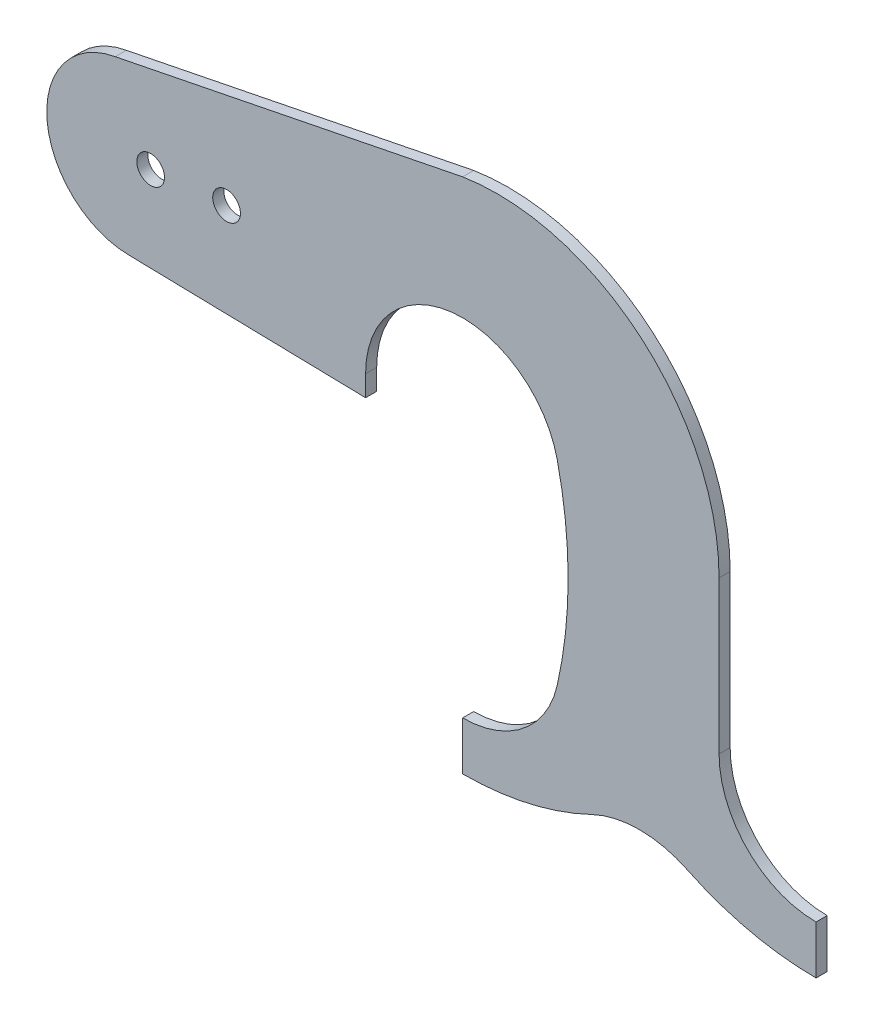
ISO-10303-21;
HEADER;
FILE_DESCRIPTION(('STEP AP214'),'2;1');
FILE_NAME('part.step','',(''),(''),'','','');
FILE_SCHEMA(('AUTOMOTIVE_DESIGN { 1 0 10303 214 1 1 1 1 }'));
ENDSEC;
DATA;
#1=APPLICATION_CONTEXT('core data for automotive mechanical design processes');
#2=APPLICATION_PROTOCOL_DEFINITION('international standard','automotive_design',2000,#1);
#3=PRODUCT_CONTEXT('',#1,'mechanical');
#4=PRODUCT('Part','Part','',(#3));
#5=PRODUCT_RELATED_PRODUCT_CATEGORY('part','',(#4));
#6=PRODUCT_DEFINITION_FORMATION('','',#4);
#7=PRODUCT_DEFINITION_CONTEXT('part definition',#1,'design');
#8=PRODUCT_DEFINITION('design','',#6,#7);
#9=PRODUCT_DEFINITION_SHAPE('','',#8);
#10=(LENGTH_UNIT() NAMED_UNIT(*) SI_UNIT(.MILLI.,.METRE.));
#11=(NAMED_UNIT(*) PLANE_ANGLE_UNIT() SI_UNIT($,.RADIAN.));
#12=(NAMED_UNIT(*) SI_UNIT($,.STERADIAN.) SOLID_ANGLE_UNIT());
#13=UNCERTAINTY_MEASURE_WITH_UNIT(LENGTH_MEASURE(1.E-05),#10,'distance_accuracy_value','');
#14=(GEOMETRIC_REPRESENTATION_CONTEXT(3) GLOBAL_UNCERTAINTY_ASSIGNED_CONTEXT((#13)) GLOBAL_UNIT_ASSIGNED_CONTEXT((#10,
#11,#12)) REPRESENTATION_CONTEXT('',''));
#15=CARTESIAN_POINT('',(0.,0.,0.));
#16=DIRECTION('',(0.,0.,1.));
#17=DIRECTION('',(1.,0.,0.));
#18=AXIS2_PLACEMENT_3D('',#15,#16,#17);
#19=CARTESIAN_POINT('',(0.,0.,10.));
#20=DIRECTION('',(0.,0.,-1.));
#21=DIRECTION('',(-1.,0.,0.));
#22=AXIS2_PLACEMENT_3D('',#19,#20,#21);
#23=PLANE('',#22);
#24=CARTESIAN_POINT('',(0.,0.,10.));
#25=DIRECTION('',(0.,0.,-1.));
#26=DIRECTION('',(-1.,0.,0.));
#27=AXIS2_PLACEMENT_3D('',#24,#25,#26);
#28=CIRCLE('',#27,87.5);
#29=CARTESIAN_POINT('',(-87.5,0.,10.));
#30=VERTEX_POINT('',#29);
#31=CARTESIAN_POINT('',(85.3562387878005,19.25,10.));
#32=VERTEX_POINT('',#31);
#33=EDGE_CURVE('E227',#30,#32,#28,.T.);
#34=ORIENTED_EDGE('',*,*,#33,.T.);
#35=CARTESIAN_POINT('',(-304.84370995643,-68.75,10.));
#36=DIRECTION('',(0.,0.,-1.));
#37=DIRECTION('',(-1.,0.,0.));
#38=AXIS2_PLACEMENT_3D('',#35,#36,#37);
#39=CIRCLE('',#38,400.);
#40=CARTESIAN_POINT('',(85.3562387878004,-156.75,10.));
#41=VERTEX_POINT('',#40);
#42=EDGE_CURVE('E121',#32,#41,#39,.T.);
#43=ORIENTED_EDGE('',*,*,#42,.T.);
#44=CARTESIAN_POINT('',(0.,-137.5,10.));
#45=DIRECTION('',(0.,0.,-1.));
#46=DIRECTION('',(1.,0.,0.));
#47=AXIS2_PLACEMENT_3D('',#44,#45,#46);
#48=CIRCLE('',#47,87.5);
#49=CARTESIAN_POINT('',(0.,-225.,10.));
#50=VERTEX_POINT('',#49);
#51=EDGE_CURVE('E276',#41,#50,#48,.T.);
#52=ORIENTED_EDGE('',*,*,#51,.T.);
#53=DIRECTION('',(0.,-1.,0.));
#54=VECTOR('',#53,1.);
#55=CARTESIAN_POINT('',(0.,-225.,10.));
#56=LINE('',#55,#54);
#57=CARTESIAN_POINT('',(0.,-268.75,10.));
#58=VERTEX_POINT('',#57);
#59=EDGE_CURVE('E296',#50,#58,#56,.T.);
#60=ORIENTED_EDGE('',*,*,#59,.T.);
#61=CARTESIAN_POINT('',(0.,0.,10.));
#62=DIRECTION('',(0.,0.,1.));
#63=DIRECTION('',(1.,0.,0.));
#64=AXIS2_PLACEMENT_3D('',#61,#62,#63);
#65=CIRCLE('',#64,268.75);
#66=CARTESIAN_POINT('',(116.15465997696,-242.352341572424,10.));
#67=VERTEX_POINT('',#66);
#68=EDGE_CURVE('E292',#58,#67,#65,.T.);
#69=ORIENTED_EDGE('',*,*,#68,.T.);
#70=CARTESIAN_POINT('',(159.374998573038,-332.529957041233,10.));
#71=DIRECTION('',(0.,0.,-1.));
#72=DIRECTION('',(-1.,0.,0.));
#73=AXIS2_PLACEMENT_3D('',#70,#71,#72);
#74=CIRCLE('',#73,100.);
#75=CARTESIAN_POINT('',(202.595337169116,-242.352341572423,10.));
#76=VERTEX_POINT('',#75);
#77=EDGE_CURVE('E295',#67,#76,#74,.T.);
#78=ORIENTED_EDGE('',*,*,#77,.T.);
#79=CARTESIAN_POINT('',(318.749997146078,0.,10.));
#80=DIRECTION('',(0.,0.,1.));
#81=DIRECTION('',(-1.,0.,0.));
#82=AXIS2_PLACEMENT_3D('',#79,#80,#81);
#83=CIRCLE('',#82,268.75);
#84=CARTESIAN_POINT('',(318.749997146078,-268.75,10.));
#85=VERTEX_POINT('',#84);
#86=EDGE_CURVE('E300',#76,#85,#83,.T.);
#87=ORIENTED_EDGE('',*,*,#86,.T.);
#88=DIRECTION('',(0.,1.,0.));
#89=VECTOR('',#88,1.);
#90=CARTESIAN_POINT('',(318.749997146078,-225.,10.));
#91=LINE('',#90,#89);
#92=CARTESIAN_POINT('',(318.749997146078,-225.,10.));
#93=VERTEX_POINT('',#92);
#94=EDGE_CURVE('E307',#85,#93,#91,.T.);
#95=ORIENTED_EDGE('',*,*,#94,.T.);
#96=CARTESIAN_POINT('',(318.75,-137.5,10.));
#97=DIRECTION('',(0.,0.,-1.));
#98=DIRECTION('',(1.,0.,0.));
#99=AXIS2_PLACEMENT_3D('',#96,#97,#98);
#100=CIRCLE('',#99,87.5);
#101=CARTESIAN_POINT('',(231.25,-137.5,10.));
#102=VERTEX_POINT('',#101);
#103=EDGE_CURVE('E310',#93,#102,#100,.T.);
#104=ORIENTED_EDGE('',*,*,#103,.T.);
#105=DIRECTION('',(0.,1.,0.));
#106=VECTOR('',#105,1.);
#107=CARTESIAN_POINT('',(231.25,0.,10.));
#108=LINE('',#107,#106);
#109=CARTESIAN_POINT('',(231.25,0.,10.));
#110=VERTEX_POINT('',#109);
#111=EDGE_CURVE('E313',#102,#110,#108,.T.);
#112=ORIENTED_EDGE('',*,*,#111,.T.);
#113=CARTESIAN_POINT('',(31.25,0.,10.));
#114=DIRECTION('',(0.,0.,1.));
#115=DIRECTION('',(1.,0.,0.));
#116=AXIS2_PLACEMENT_3D('',#113,#114,#115);
#117=CIRCLE('',#116,200.);
#118=CARTESIAN_POINT('',(0.,197.543507865989,10.));
#119=VERTEX_POINT('',#118);
#120=EDGE_CURVE('E316',#110,#119,#117,.T.);
#121=ORIENTED_EDGE('',*,*,#120,.T.);
#122=DIRECTION('',(-0.980493102835372,-0.196553492190459,0.));
#123=VECTOR('',#122,1.);
#124=CARTESIAN_POINT('',(-313.269508591437,134.744273753707,10.));
#125=LINE('',#124,#123);
#126=CARTESIAN_POINT('',(-313.269508591437,134.744273753707,10.));
#127=VERTEX_POINT('',#126);
#128=EDGE_CURVE('E161',#119,#127,#125,.T.);
#129=ORIENTED_EDGE('',*,*,#128,.T.);
#130=CARTESIAN_POINT('',(-300.,60.9274725378472,10.));
#131=DIRECTION('',(0.,0.,1.));
#132=DIRECTION('',(1.,0.,0.));
#133=AXIS2_PLACEMENT_3D('',#130,#131,#132);
#134=CIRCLE('',#133,75.);
#135=CARTESIAN_POINT('',(-300.,-14.0725274621528,10.));
#136=VERTEX_POINT('',#135);
#137=EDGE_CURVE('E155',#127,#136,#134,.T.);
#138=ORIENTED_EDGE('',*,*,#137,.T.);
#139=DIRECTION('',(0.99975783194838,-0.0220063049573469,0.));
#140=VECTOR('',#139,1.);
#141=CARTESIAN_POINT('',(-300.,-14.0725274621528,10.));
#142=LINE('',#141,#140);
#143=CARTESIAN_POINT('',(-87.5,-18.75,10.));
#144=VERTEX_POINT('',#143);
#145=EDGE_CURVE('E159',#136,#144,#142,.T.);
#146=ORIENTED_EDGE('',*,*,#145,.T.);
#147=DIRECTION('',(0.,1.,0.));
#148=VECTOR('',#147,1.);
#149=CARTESIAN_POINT('',(-87.5,0.,10.));
#150=LINE('',#149,#148);
#151=EDGE_CURVE('E57',#144,#30,#150,.T.);
#152=ORIENTED_EDGE('',*,*,#151,.T.);
#153=EDGE_LOOP('',(#34,#43,#52,#60,#69,#78,#87,#95,#104,#112,#121,#129,#138,#146,#152));
#154=FACE_BOUND('',#153,.T.);
#155=CARTESIAN_POINT('',(-281.324943497672,62.6022156927411,10.));
#156=DIRECTION('',(0.,0.,1.));
#157=DIRECTION('',(1.,0.,0.));
#158=AXIS2_PLACEMENT_3D('',#155,#156,#157);
#159=CIRCLE('',#158,12.5);
#160=CARTESIAN_POINT('',(-268.824943497672,62.6022156927411,10.));
#161=VERTEX_POINT('',#160);
#162=EDGE_CURVE('E188',#161,#161,#159,.T.);
#163=ORIENTED_EDGE('',*,*,#162,.F.);
#164=EDGE_LOOP('',(#163));
#165=FACE_BOUND('',#164,.T.);
#166=CARTESIAN_POINT('',(-212.84973632247,68.7429405940186,10.));
#167=DIRECTION('',(0.,0.,1.));
#168=DIRECTION('',(1.,0.,0.));
#169=AXIS2_PLACEMENT_3D('',#166,#167,#168);
#170=CIRCLE('',#169,12.5);
#171=CARTESIAN_POINT('',(-200.34973632247,68.7429405940186,10.));
#172=VERTEX_POINT('',#171);
#173=EDGE_CURVE('E359',#172,#172,#170,.T.);
#174=ORIENTED_EDGE('',*,*,#173,.F.);
#175=EDGE_LOOP('',(#174));
#176=FACE_BOUND('',#175,.T.);
#177=ADVANCED_FACE('F39',(#154,#165,#176),#23,.F.);
#178=CARTESIAN_POINT('',(0.,0.,0.));
#179=DIRECTION('',(0.,0.,-1.));
#180=DIRECTION('',(-1.,0.,0.));
#181=AXIS2_PLACEMENT_3D('',#178,#179,#180);
#182=PLANE('',#181);
#183=CARTESIAN_POINT('',(-281.324943497672,62.6022156927411,0.));
#184=DIRECTION('',(0.,0.,1.));
#185=DIRECTION('',(1.,0.,0.));
#186=AXIS2_PLACEMENT_3D('',#183,#184,#185);
#187=CIRCLE('',#186,12.5);
#188=CARTESIAN_POINT('',(-268.824943497672,62.6022156927411,0.));
#189=VERTEX_POINT('',#188);
#190=EDGE_CURVE('E366',#189,#189,#187,.T.);
#191=ORIENTED_EDGE('',*,*,#190,.T.);
#192=EDGE_LOOP('',(#191));
#193=FACE_BOUND('',#192,.T.);
#194=CARTESIAN_POINT('',(0.,0.,0.));
#195=DIRECTION('',(0.,0.,-1.));
#196=DIRECTION('',(-1.,0.,0.));
#197=AXIS2_PLACEMENT_3D('',#194,#195,#196);
#198=CIRCLE('',#197,87.5);
#199=CARTESIAN_POINT('',(-87.5,0.,0.));
#200=VERTEX_POINT('',#199);
#201=CARTESIAN_POINT('',(85.3562387878005,19.25,0.));
#202=VERTEX_POINT('',#201);
#203=EDGE_CURVE('E183',#200,#202,#198,.T.);
#204=ORIENTED_EDGE('',*,*,#203,.F.);
#205=DIRECTION('',(0.,1.,0.));
#206=VECTOR('',#205,1.);
#207=CARTESIAN_POINT('',(-87.5,0.,0.));
#208=LINE('',#207,#206);
#209=CARTESIAN_POINT('',(-87.5,-18.75,0.));
#210=VERTEX_POINT('',#209);
#211=EDGE_CURVE('E113',#210,#200,#208,.T.);
#212=ORIENTED_EDGE('',*,*,#211,.F.);
#213=DIRECTION('',(0.99975783194838,-0.0220063049573469,0.));
#214=VECTOR('',#213,1.);
#215=CARTESIAN_POINT('',(-300.,-14.0725274621528,0.));
#216=LINE('',#215,#214);
#217=CARTESIAN_POINT('',(-300.,-14.0725274621528,0.));
#218=VERTEX_POINT('',#217);
#219=EDGE_CURVE('E107',#218,#210,#216,.T.);
#220=ORIENTED_EDGE('',*,*,#219,.F.);
#221=CARTESIAN_POINT('',(-300.,60.9274725378472,0.));
#222=DIRECTION('',(0.,0.,1.));
#223=DIRECTION('',(1.,0.,0.));
#224=AXIS2_PLACEMENT_3D('',#221,#222,#223);
#225=CIRCLE('',#224,75.);
#226=CARTESIAN_POINT('',(-313.269508591437,134.744273753707,0.));
#227=VERTEX_POINT('',#226);
#228=EDGE_CURVE('E170',#227,#218,#225,.T.);
#229=ORIENTED_EDGE('',*,*,#228,.F.);
#230=DIRECTION('',(-0.980493102835372,-0.196553492190459,0.));
#231=VECTOR('',#230,1.);
#232=CARTESIAN_POINT('',(-313.269508591437,134.744273753707,0.));
#233=LINE('',#232,#231);
#234=CARTESIAN_POINT('',(0.,197.543507865989,0.));
#235=VERTEX_POINT('',#234);
#236=EDGE_CURVE('E218',#235,#227,#233,.T.);
#237=ORIENTED_EDGE('',*,*,#236,.F.);
#238=CARTESIAN_POINT('',(31.25,0.,0.));
#239=DIRECTION('',(0.,0.,1.));
#240=DIRECTION('',(1.,0.,0.));
#241=AXIS2_PLACEMENT_3D('',#238,#239,#240);
#242=CIRCLE('',#241,200.);
#243=CARTESIAN_POINT('',(231.25,0.,0.));
#244=VERTEX_POINT('',#243);
#245=EDGE_CURVE('E215',#244,#235,#242,.T.);
#246=ORIENTED_EDGE('',*,*,#245,.F.);
#247=DIRECTION('',(0.,1.,0.));
#248=VECTOR('',#247,1.);
#249=CARTESIAN_POINT('',(231.25,0.,0.));
#250=LINE('',#249,#248);
#251=CARTESIAN_POINT('',(231.25,-137.5,0.));
#252=VERTEX_POINT('',#251);
#253=EDGE_CURVE('E212',#252,#244,#250,.T.);
#254=ORIENTED_EDGE('',*,*,#253,.F.);
#255=CARTESIAN_POINT('',(318.75,-137.5,0.));
#256=DIRECTION('',(0.,0.,-1.));
#257=DIRECTION('',(1.,0.,0.));
#258=AXIS2_PLACEMENT_3D('',#255,#256,#257);
#259=CIRCLE('',#258,87.5);
#260=CARTESIAN_POINT('',(318.749997146078,-225.,0.));
#261=VERTEX_POINT('',#260);
#262=EDGE_CURVE('E209',#261,#252,#259,.T.);
#263=ORIENTED_EDGE('',*,*,#262,.F.);
#264=DIRECTION('',(0.,1.,0.));
#265=VECTOR('',#264,1.);
#266=CARTESIAN_POINT('',(318.749997146078,-225.,0.));
#267=LINE('',#266,#265);
#268=CARTESIAN_POINT('',(318.749997146078,-268.75,0.));
#269=VERTEX_POINT('',#268);
#270=EDGE_CURVE('E206',#269,#261,#267,.T.);
#271=ORIENTED_EDGE('',*,*,#270,.F.);
#272=CARTESIAN_POINT('',(318.749997146078,0.,0.));
#273=DIRECTION('',(0.,0.,1.));
#274=DIRECTION('',(-1.,0.,0.));
#275=AXIS2_PLACEMENT_3D('',#272,#273,#274);
#276=CIRCLE('',#275,268.75);
#277=CARTESIAN_POINT('',(202.595337169116,-242.352341572423,0.));
#278=VERTEX_POINT('',#277);
#279=EDGE_CURVE('E203',#278,#269,#276,.T.);
#280=ORIENTED_EDGE('',*,*,#279,.F.);
#281=CARTESIAN_POINT('',(159.374998573038,-332.529957041233,0.));
#282=DIRECTION('',(0.,0.,-1.));
#283=DIRECTION('',(-1.,0.,0.));
#284=AXIS2_PLACEMENT_3D('',#281,#282,#283);
#285=CIRCLE('',#284,100.);
#286=CARTESIAN_POINT('',(116.15465997696,-242.352341572424,0.));
#287=VERTEX_POINT('',#286);
#288=EDGE_CURVE('E200',#287,#278,#285,.T.);
#289=ORIENTED_EDGE('',*,*,#288,.F.);
#290=CARTESIAN_POINT('',(0.,0.,0.));
#291=DIRECTION('',(0.,0.,1.));
#292=DIRECTION('',(1.,0.,0.));
#293=AXIS2_PLACEMENT_3D('',#290,#291,#292);
#294=CIRCLE('',#293,268.75);
#295=CARTESIAN_POINT('',(0.,-268.75,0.));
#296=VERTEX_POINT('',#295);
#297=EDGE_CURVE('E197',#296,#287,#294,.T.);
#298=ORIENTED_EDGE('',*,*,#297,.F.);
#299=DIRECTION('',(0.,-1.,0.));
#300=VECTOR('',#299,1.);
#301=CARTESIAN_POINT('',(0.,-225.,0.));
#302=LINE('',#301,#300);
#303=CARTESIAN_POINT('',(0.,-225.,0.));
#304=VERTEX_POINT('',#303);
#305=EDGE_CURVE('E194',#304,#296,#302,.T.);
#306=ORIENTED_EDGE('',*,*,#305,.F.);
#307=CARTESIAN_POINT('',(0.,-137.5,0.));
#308=DIRECTION('',(0.,0.,-1.));
#309=DIRECTION('',(1.,0.,0.));
#310=AXIS2_PLACEMENT_3D('',#307,#308,#309);
#311=CIRCLE('',#310,87.5);
#312=CARTESIAN_POINT('',(85.3562387878004,-156.75,0.));
#313=VERTEX_POINT('',#312);
#314=EDGE_CURVE('E191',#313,#304,#311,.T.);
#315=ORIENTED_EDGE('',*,*,#314,.F.);
#316=CARTESIAN_POINT('',(-304.84370995643,-68.75,0.));
#317=DIRECTION('',(0.,0.,-1.));
#318=DIRECTION('',(-1.,0.,0.));
#319=AXIS2_PLACEMENT_3D('',#316,#317,#318);
#320=CIRCLE('',#319,400.);
#321=EDGE_CURVE('E187',#202,#313,#320,.T.);
#322=ORIENTED_EDGE('',*,*,#321,.F.);
#323=EDGE_LOOP('',(#204,#212,#220,#229,#237,#246,#254,#263,#271,#280,#289,#298,#306,#315,#322));
#324=FACE_BOUND('',#323,.T.);
#325=CARTESIAN_POINT('',(-212.84973632247,68.7429405940186,0.));
#326=DIRECTION('',(0.,0.,1.));
#327=DIRECTION('',(1.,0.,0.));
#328=AXIS2_PLACEMENT_3D('',#325,#326,#327);
#329=CIRCLE('',#328,12.5);
#330=CARTESIAN_POINT('',(-200.34973632247,68.7429405940186,0.));
#331=VERTEX_POINT('',#330);
#332=EDGE_CURVE('E362',#331,#331,#329,.T.);
#333=ORIENTED_EDGE('',*,*,#332,.T.);
#334=EDGE_LOOP('',(#333));
#335=FACE_BOUND('',#334,.T.);
#336=ADVANCED_FACE('F280',(#193,#324,#335),#182,.T.);
#337=CARTESIAN_POINT('',(0.,0.,10.));
#338=DIRECTION('',(0.,0.,-1.));
#339=DIRECTION('',(-1.,0.,0.));
#340=AXIS2_PLACEMENT_3D('',#337,#338,#339);
#341=CYLINDRICAL_SURFACE('',#340,87.5);
#342=ORIENTED_EDGE('',*,*,#203,.T.);
#343=DIRECTION('',(0.,0.,-1.));
#344=VECTOR('',#343,1.);
#345=CARTESIAN_POINT('',(85.3562387878005,19.25,10.));
#346=LINE('',#345,#344);
#347=EDGE_CURVE('E11',#32,#202,#346,.T.);
#348=ORIENTED_EDGE('',*,*,#347,.F.);
#349=ORIENTED_EDGE('',*,*,#33,.F.);
#350=DIRECTION('',(0.,0.,-1.));
#351=VECTOR('',#350,1.);
#352=CARTESIAN_POINT('',(-87.5,0.,10.));
#353=LINE('',#352,#351);
#354=EDGE_CURVE('E179',#30,#200,#353,.T.);
#355=ORIENTED_EDGE('',*,*,#354,.T.);
#356=EDGE_LOOP('',(#342,#348,#349,#355));
#357=FACE_BOUND('',#356,.T.);
#358=ADVANCED_FACE('F41',(#357),#341,.F.);
#359=CARTESIAN_POINT('',(-304.84370995643,-68.75,10.));
#360=DIRECTION('',(0.,0.,-1.));
#361=DIRECTION('',(-1.,0.,0.));
#362=AXIS2_PLACEMENT_3D('',#359,#360,#361);
#363=CYLINDRICAL_SURFACE('',#362,400.);
#364=ORIENTED_EDGE('',*,*,#321,.T.);
#365=DIRECTION('',(0.,0.,-1.));
#366=VECTOR('',#365,1.);
#367=CARTESIAN_POINT('',(85.3562387878004,-156.75,10.));
#368=LINE('',#367,#366);
#369=EDGE_CURVE('E49',#41,#313,#368,.T.);
#370=ORIENTED_EDGE('',*,*,#369,.F.);
#371=ORIENTED_EDGE('',*,*,#42,.F.);
#372=ORIENTED_EDGE('',*,*,#347,.T.);
#373=EDGE_LOOP('',(#364,#370,#371,#372));
#374=FACE_BOUND('',#373,.T.);
#375=ADVANCED_FACE('F496',(#374),#363,.F.);
#376=CARTESIAN_POINT('',(0.,-137.5,10.));
#377=DIRECTION('',(0.,0.,-1.));
#378=DIRECTION('',(-1.,0.,0.));
#379=AXIS2_PLACEMENT_3D('',#376,#377,#378);
#380=CYLINDRICAL_SURFACE('',#379,87.5);
#381=ORIENTED_EDGE('',*,*,#314,.T.);
#382=DIRECTION('',(0.,0.,-1.));
#383=VECTOR('',#382,1.);
#384=CARTESIAN_POINT('',(0.,-225.,10.));
#385=LINE('',#384,#383);
#386=EDGE_CURVE('E266',#50,#304,#385,.T.);
#387=ORIENTED_EDGE('',*,*,#386,.F.);
#388=ORIENTED_EDGE('',*,*,#51,.F.);
#389=ORIENTED_EDGE('',*,*,#369,.T.);
#390=EDGE_LOOP('',(#381,#387,#388,#389));
#391=FACE_BOUND('',#390,.T.);
#392=ADVANCED_FACE('F274',(#391),#380,.F.);
#393=CARTESIAN_POINT('',(0.,-225.,10.));
#394=DIRECTION('',(1.,0.,0.));
#395=DIRECTION('',(0.,1.,0.));
#396=AXIS2_PLACEMENT_3D('',#393,#394,#395);
#397=PLANE('',#396);
#398=ORIENTED_EDGE('',*,*,#305,.T.);
#399=DIRECTION('',(0.,0.,-1.));
#400=VECTOR('',#399,1.);
#401=CARTESIAN_POINT('',(0.,-268.75,10.));
#402=LINE('',#401,#400);
#403=EDGE_CURVE('E262',#58,#296,#402,.T.);
#404=ORIENTED_EDGE('',*,*,#403,.F.);
#405=ORIENTED_EDGE('',*,*,#59,.F.);
#406=ORIENTED_EDGE('',*,*,#386,.T.);
#407=EDGE_LOOP('',(#398,#404,#405,#406));
#408=FACE_BOUND('',#407,.T.);
#409=ADVANCED_FACE('F286',(#408),#397,.F.);
#410=CARTESIAN_POINT('',(0.,0.,10.));
#411=DIRECTION('',(0.,0.,-1.));
#412=DIRECTION('',(-1.,0.,0.));
#413=AXIS2_PLACEMENT_3D('',#410,#411,#412);
#414=CYLINDRICAL_SURFACE('',#413,268.75);
#415=ORIENTED_EDGE('',*,*,#297,.T.);
#416=DIRECTION('',(0.,0.,-1.));
#417=VECTOR('',#416,1.);
#418=CARTESIAN_POINT('',(116.15465997696,-242.352341572424,10.));
#419=LINE('',#418,#417);
#420=EDGE_CURVE('E258',#67,#287,#419,.T.);
#421=ORIENTED_EDGE('',*,*,#420,.F.);
#422=ORIENTED_EDGE('',*,*,#68,.F.);
#423=ORIENTED_EDGE('',*,*,#403,.T.);
#424=EDGE_LOOP('',(#415,#421,#422,#423));
#425=FACE_BOUND('',#424,.T.);
#426=ADVANCED_FACE('F290',(#425),#414,.T.);
#427=CARTESIAN_POINT('',(159.374998573038,-332.529957041233,10.));
#428=DIRECTION('',(0.,0.,-1.));
#429=DIRECTION('',(-1.,0.,0.));
#430=AXIS2_PLACEMENT_3D('',#427,#428,#429);
#431=CYLINDRICAL_SURFACE('',#430,100.);
#432=ORIENTED_EDGE('',*,*,#288,.T.);
#433=DIRECTION('',(0.,0.,-1.));
#434=VECTOR('',#433,1.);
#435=CARTESIAN_POINT('',(202.595337169116,-242.352341572423,10.));
#436=LINE('',#435,#434);
#437=EDGE_CURVE('E254',#76,#278,#436,.T.);
#438=ORIENTED_EDGE('',*,*,#437,.F.);
#439=ORIENTED_EDGE('',*,*,#77,.F.);
#440=ORIENTED_EDGE('',*,*,#420,.T.);
#441=EDGE_LOOP('',(#432,#438,#439,#440));
#442=FACE_BOUND('',#441,.T.);
#443=ADVANCED_FACE('F461',(#442),#431,.F.);
#444=CARTESIAN_POINT('',(318.749997146078,0.,10.));
#445=DIRECTION('',(0.,0.,-1.));
#446=DIRECTION('',(-1.,0.,0.));
#447=AXIS2_PLACEMENT_3D('',#444,#445,#446);
#448=CYLINDRICAL_SURFACE('',#447,268.75);
#449=ORIENTED_EDGE('',*,*,#279,.T.);
#450=DIRECTION('',(0.,0.,-1.));
#451=VECTOR('',#450,1.);
#452=CARTESIAN_POINT('',(318.749997146078,-268.75,10.));
#453=LINE('',#452,#451);
#454=EDGE_CURVE('E250',#85,#269,#453,.T.);
#455=ORIENTED_EDGE('',*,*,#454,.F.);
#456=ORIENTED_EDGE('',*,*,#86,.F.);
#457=ORIENTED_EDGE('',*,*,#437,.T.);
#458=EDGE_LOOP('',(#449,#455,#456,#457));
#459=FACE_BOUND('',#458,.T.);
#460=ADVANCED_FACE('F451',(#459),#448,.T.);
#461=CARTESIAN_POINT('',(318.749997146078,-225.,10.));
#462=DIRECTION('',(-1.,0.,0.));
#463=DIRECTION('',(0.,0.,1.));
#464=AXIS2_PLACEMENT_3D('',#461,#462,#463);
#465=PLANE('',#464);
#466=ORIENTED_EDGE('',*,*,#270,.T.);
#467=DIRECTION('',(0.,0.,-1.));
#468=VECTOR('',#467,1.);
#469=CARTESIAN_POINT('',(318.749997146078,-225.,10.));
#470=LINE('',#469,#468);
#471=EDGE_CURVE('E246',#93,#261,#470,.T.);
#472=ORIENTED_EDGE('',*,*,#471,.F.);
#473=ORIENTED_EDGE('',*,*,#94,.F.);
#474=ORIENTED_EDGE('',*,*,#454,.T.);
#475=EDGE_LOOP('',(#466,#472,#473,#474));
#476=FACE_BOUND('',#475,.T.);
#477=ADVANCED_FACE('F441',(#476),#465,.F.);
#478=CARTESIAN_POINT('',(318.75,-137.5,10.));
#479=DIRECTION('',(0.,0.,-1.));
#480=DIRECTION('',(-1.,0.,0.));
#481=AXIS2_PLACEMENT_3D('',#478,#479,#480);
#482=CYLINDRICAL_SURFACE('',#481,87.5);
#483=ORIENTED_EDGE('',*,*,#262,.T.);
#484=DIRECTION('',(0.,0.,-1.));
#485=VECTOR('',#484,1.);
#486=CARTESIAN_POINT('',(231.25,-137.5,10.));
#487=LINE('',#486,#485);
#488=EDGE_CURVE('E242',#102,#252,#487,.T.);
#489=ORIENTED_EDGE('',*,*,#488,.F.);
#490=ORIENTED_EDGE('',*,*,#103,.F.);
#491=ORIENTED_EDGE('',*,*,#471,.T.);
#492=EDGE_LOOP('',(#483,#489,#490,#491));
#493=FACE_BOUND('',#492,.T.);
#494=ADVANCED_FACE('F431',(#493),#482,.F.);
#495=CARTESIAN_POINT('',(231.25,0.,10.));
#496=DIRECTION('',(-1.,0.,0.));
#497=DIRECTION('',(0.,-1.,0.));
#498=AXIS2_PLACEMENT_3D('',#495,#496,#497);
#499=PLANE('',#498);
#500=ORIENTED_EDGE('',*,*,#253,.T.);
#501=DIRECTION('',(0.,0.,-1.));
#502=VECTOR('',#501,1.);
#503=CARTESIAN_POINT('',(231.25,0.,10.));
#504=LINE('',#503,#502);
#505=EDGE_CURVE('E238',#110,#244,#504,.T.);
#506=ORIENTED_EDGE('',*,*,#505,.F.);
#507=ORIENTED_EDGE('',*,*,#111,.F.);
#508=ORIENTED_EDGE('',*,*,#488,.T.);
#509=EDGE_LOOP('',(#500,#506,#507,#508));
#510=FACE_BOUND('',#509,.T.);
#511=ADVANCED_FACE('F422',(#510),#499,.F.);
#512=CARTESIAN_POINT('',(31.25,0.,10.));
#513=DIRECTION('',(0.,0.,-1.));
#514=DIRECTION('',(-1.,0.,0.));
#515=AXIS2_PLACEMENT_3D('',#512,#513,#514);
#516=CYLINDRICAL_SURFACE('',#515,200.);
#517=ORIENTED_EDGE('',*,*,#245,.T.);
#518=DIRECTION('',(0.,0.,-1.));
#519=VECTOR('',#518,1.);
#520=CARTESIAN_POINT('',(0.,197.543507865989,10.));
#521=LINE('',#520,#519);
#522=EDGE_CURVE('E234',#119,#235,#521,.T.);
#523=ORIENTED_EDGE('',*,*,#522,.F.);
#524=ORIENTED_EDGE('',*,*,#120,.F.);
#525=ORIENTED_EDGE('',*,*,#505,.T.);
#526=EDGE_LOOP('',(#517,#523,#524,#525));
#527=FACE_BOUND('',#526,.T.);
#528=ADVANCED_FACE('F324',(#527),#516,.T.);
#529=CARTESIAN_POINT('',(-313.269508591437,134.744273753707,10.));
#530=DIRECTION('',(0.196553492190459,-0.980493102835372,0.));
#531=DIRECTION('',(0.980493102835372,0.196553492190459,0.));
#532=AXIS2_PLACEMENT_3D('',#529,#530,#531);
#533=PLANE('',#532);
#534=ORIENTED_EDGE('',*,*,#236,.T.);
#535=DIRECTION('',(0.,0.,-1.));
#536=VECTOR('',#535,1.);
#537=CARTESIAN_POINT('',(-313.269508591437,134.744273753707,10.));
#538=LINE('',#537,#536);
#539=EDGE_CURVE('E172',#127,#227,#538,.T.);
#540=ORIENTED_EDGE('',*,*,#539,.F.);
#541=ORIENTED_EDGE('',*,*,#128,.F.);
#542=ORIENTED_EDGE('',*,*,#522,.T.);
#543=EDGE_LOOP('',(#534,#540,#541,#542));
#544=FACE_BOUND('',#543,.T.);
#545=ADVANCED_FACE('F328',(#544),#533,.F.);
#546=CARTESIAN_POINT('',(-300.,60.9274725378472,10.));
#547=DIRECTION('',(0.,0.,-1.));
#548=DIRECTION('',(-1.,0.,0.));
#549=AXIS2_PLACEMENT_3D('',#546,#547,#548);
#550=CYLINDRICAL_SURFACE('',#549,75.);
#551=ORIENTED_EDGE('',*,*,#228,.T.);
#552=DIRECTION('',(0.,0.,-1.));
#553=VECTOR('',#552,1.);
#554=CARTESIAN_POINT('',(-300.,-14.0725274621528,10.));
#555=LINE('',#554,#553);
#556=EDGE_CURVE('E167',#136,#218,#555,.T.);
#557=ORIENTED_EDGE('',*,*,#556,.F.);
#558=ORIENTED_EDGE('',*,*,#137,.F.);
#559=ORIENTED_EDGE('',*,*,#539,.T.);
#560=EDGE_LOOP('',(#551,#557,#558,#559));
#561=FACE_BOUND('',#560,.T.);
#562=ADVANCED_FACE('F168',(#561),#550,.T.);
#563=CARTESIAN_POINT('',(-300.,-14.0725274621528,10.));
#564=DIRECTION('',(0.0220063049573469,0.99975783194838,0.));
#565=DIRECTION('',(-0.99975783194838,0.0220063049573469,0.));
#566=AXIS2_PLACEMENT_3D('',#563,#564,#565);
#567=PLANE('',#566);
#568=ORIENTED_EDGE('',*,*,#219,.T.);
#569=DIRECTION('',(0.,0.,-1.));
#570=VECTOR('',#569,1.);
#571=CARTESIAN_POINT('',(-87.5,-18.75,10.));
#572=LINE('',#571,#570);
#573=EDGE_CURVE('E173',#144,#210,#572,.T.);
#574=ORIENTED_EDGE('',*,*,#573,.F.);
#575=ORIENTED_EDGE('',*,*,#145,.F.);
#576=ORIENTED_EDGE('',*,*,#556,.T.);
#577=EDGE_LOOP('',(#568,#574,#575,#576));
#578=FACE_BOUND('',#577,.T.);
#579=ADVANCED_FACE('F175',(#578),#567,.F.);
#580=CARTESIAN_POINT('',(-87.5,0.,10.));
#581=DIRECTION('',(-1.,0.,0.));
#582=DIRECTION('',(0.,0.,1.));
#583=AXIS2_PLACEMENT_3D('',#580,#581,#582);
#584=PLANE('',#583);
#585=ORIENTED_EDGE('',*,*,#211,.T.);
#586=ORIENTED_EDGE('',*,*,#354,.F.);
#587=ORIENTED_EDGE('',*,*,#151,.F.);
#588=ORIENTED_EDGE('',*,*,#573,.T.);
#589=EDGE_LOOP('',(#585,#586,#587,#588));
#590=FACE_BOUND('',#589,.T.);
#591=ADVANCED_FACE('F332',(#590),#584,.F.);
#592=CARTESIAN_POINT('',(-281.324943497672,62.6022156927411,10.));
#593=DIRECTION('',(0.,0.,-1.));
#594=DIRECTION('',(-1.,0.,0.));
#595=AXIS2_PLACEMENT_3D('',#592,#593,#594);
#596=CYLINDRICAL_SURFACE('',#595,12.5);
#597=ORIENTED_EDGE('',*,*,#162,.T.);
#598=EDGE_LOOP('',(#597));
#599=FACE_BOUND('',#598,.T.);
#600=ORIENTED_EDGE('',*,*,#190,.F.);
#601=EDGE_LOOP('',(#600));
#602=FACE_BOUND('',#601,.T.);
#603=ADVANCED_FACE('F334',(#599,#602),#596,.F.);
#604=CARTESIAN_POINT('',(-212.84973632247,68.7429405940186,10.));
#605=DIRECTION('',(0.,0.,-1.));
#606=DIRECTION('',(-1.,0.,0.));
#607=AXIS2_PLACEMENT_3D('',#604,#605,#606);
#608=CYLINDRICAL_SURFACE('',#607,12.5);
#609=ORIENTED_EDGE('',*,*,#173,.T.);
#610=EDGE_LOOP('',(#609));
#611=FACE_BOUND('',#610,.T.);
#612=ORIENTED_EDGE('',*,*,#332,.F.);
#613=EDGE_LOOP('',(#612));
#614=FACE_BOUND('',#613,.T.);
#615=ADVANCED_FACE('F340',(#611,#614),#608,.F.);
#616=CLOSED_SHELL('',(#177,#336,#358,#375,#392,#409,#426,#443,#460,#477,#494,#511,#528,#545,
#562,#579,#591,#603,#615));
#617=MANIFOLD_SOLID_BREP('B2',#616);
#618=ADVANCED_BREP_SHAPE_REPRESENTATION('',(#18,#617),#14);
#619=SHAPE_DEFINITION_REPRESENTATION(#9,#618);
ENDSEC;
END-ISO-10303-21;
